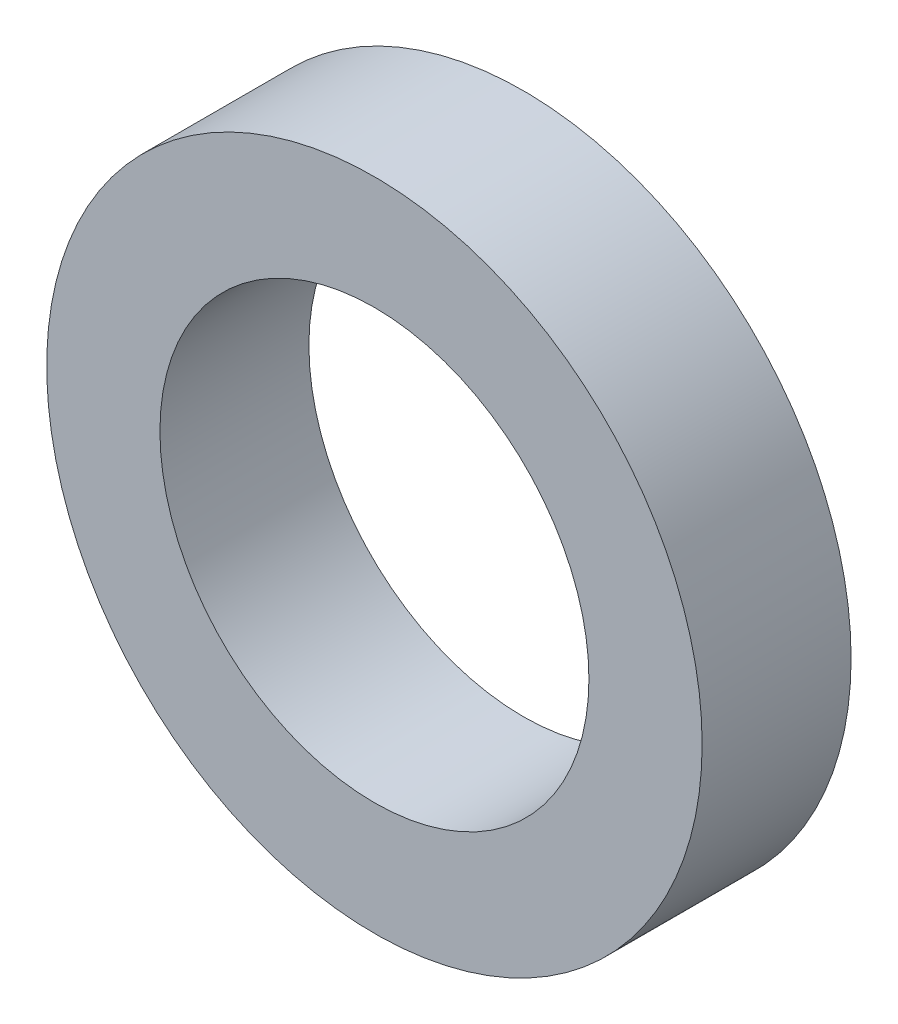
ISO-10303-21;
HEADER;
FILE_DESCRIPTION(('STEP AP214'),'2;1');
FILE_NAME('part.step','',(''),(''),'','','');
FILE_SCHEMA(('AUTOMOTIVE_DESIGN { 1 0 10303 214 1 1 1 1 }'));
ENDSEC;
DATA;
#1=APPLICATION_CONTEXT('core data for automotive mechanical design processes');
#2=APPLICATION_PROTOCOL_DEFINITION('international standard','automotive_design',2000,#1);
#3=PRODUCT_CONTEXT('',#1,'mechanical');
#4=PRODUCT('Part','Part','',(#3));
#5=PRODUCT_RELATED_PRODUCT_CATEGORY('part','',(#4));
#6=PRODUCT_DEFINITION_FORMATION('','',#4);
#7=PRODUCT_DEFINITION_CONTEXT('part definition',#1,'design');
#8=PRODUCT_DEFINITION('design','',#6,#7);
#9=PRODUCT_DEFINITION_SHAPE('','',#8);
#10=(LENGTH_UNIT() NAMED_UNIT(*) SI_UNIT(.MILLI.,.METRE.));
#11=(NAMED_UNIT(*) PLANE_ANGLE_UNIT() SI_UNIT($,.RADIAN.));
#12=(NAMED_UNIT(*) SI_UNIT($,.STERADIAN.) SOLID_ANGLE_UNIT());
#13=UNCERTAINTY_MEASURE_WITH_UNIT(LENGTH_MEASURE(1.E-05),#10,'distance_accuracy_value','');
#14=(GEOMETRIC_REPRESENTATION_CONTEXT(3) GLOBAL_UNCERTAINTY_ASSIGNED_CONTEXT((#13)) GLOBAL_UNIT_ASSIGNED_CONTEXT((#10,
#11,#12)) REPRESENTATION_CONTEXT('',''));
#15=CARTESIAN_POINT('',(0.,0.,0.));
#16=DIRECTION('',(0.,0.,1.));
#17=DIRECTION('',(1.,0.,0.));
#18=AXIS2_PLACEMENT_3D('',#15,#16,#17);
#19=CARTESIAN_POINT('',(0.,0.,2.5));
#20=DIRECTION('',(0.,0.,-1.));
#21=DIRECTION('',(-1.,0.,0.));
#22=AXIS2_PLACEMENT_3D('',#19,#20,#21);
#23=CYLINDRICAL_SURFACE('',#22,5.5);
#24=CARTESIAN_POINT('',(0.,0.,2.5));
#25=DIRECTION('',(0.,0.,1.));
#26=DIRECTION('',(1.,0.,0.));
#27=AXIS2_PLACEMENT_3D('',#24,#25,#26);
#28=CIRCLE('',#27,5.5);
#29=CARTESIAN_POINT('',(5.5,0.,2.5));
#30=VERTEX_POINT('',#29);
#31=EDGE_CURVE('E10',#30,#30,#28,.T.);
#32=ORIENTED_EDGE('',*,*,#31,.F.);
#33=EDGE_LOOP('',(#32));
#34=FACE_BOUND('',#33,.T.);
#35=CARTESIAN_POINT('',(0.,0.,0.));
#36=DIRECTION('',(0.,0.,1.));
#37=DIRECTION('',(1.,0.,0.));
#38=AXIS2_PLACEMENT_3D('',#35,#36,#37);
#39=CIRCLE('',#38,5.5);
#40=CARTESIAN_POINT('',(5.5,0.,0.));
#41=VERTEX_POINT('',#40);
#42=EDGE_CURVE('E48',#41,#41,#39,.T.);
#43=ORIENTED_EDGE('',*,*,#42,.T.);
#44=EDGE_LOOP('',(#43));
#45=FACE_BOUND('',#44,.T.);
#46=ADVANCED_FACE('F41',(#34,#45),#23,.T.);
#47=CARTESIAN_POINT('',(0.,0.,2.5));
#48=DIRECTION('',(0.,0.,1.));
#49=DIRECTION('',(1.,0.,0.));
#50=AXIS2_PLACEMENT_3D('',#47,#48,#49);
#51=PLANE('',#50);
#52=CARTESIAN_POINT('',(0.,0.,2.5));
#53=DIRECTION('',(0.,0.,1.));
#54=DIRECTION('',(1.,0.,0.));
#55=AXIS2_PLACEMENT_3D('',#52,#53,#54);
#56=CIRCLE('',#55,3.6);
#57=CARTESIAN_POINT('',(3.6,0.,2.5));
#58=VERTEX_POINT('',#57);
#59=EDGE_CURVE('E54',#58,#58,#56,.T.);
#60=ORIENTED_EDGE('',*,*,#59,.F.);
#61=EDGE_LOOP('',(#60));
#62=FACE_BOUND('',#61,.T.);
#63=ORIENTED_EDGE('',*,*,#31,.T.);
#64=EDGE_LOOP('',(#63));
#65=FACE_BOUND('',#64,.T.);
#66=ADVANCED_FACE('F66',(#62,#65),#51,.T.);
#67=CARTESIAN_POINT('',(0.,0.,0.));
#68=DIRECTION('',(0.,0.,1.));
#69=DIRECTION('',(1.,0.,0.));
#70=AXIS2_PLACEMENT_3D('',#67,#68,#69);
#71=PLANE('',#70);
#72=CARTESIAN_POINT('',(0.,0.,0.));
#73=DIRECTION('',(0.,0.,1.));
#74=DIRECTION('',(1.,0.,0.));
#75=AXIS2_PLACEMENT_3D('',#72,#73,#74);
#76=CIRCLE('',#75,3.6);
#77=CARTESIAN_POINT('',(3.6,0.,0.));
#78=VERTEX_POINT('',#77);
#79=EDGE_CURVE('E44',#78,#78,#76,.F.);
#80=ORIENTED_EDGE('',*,*,#79,.F.);
#81=EDGE_LOOP('',(#80));
#82=FACE_BOUND('',#81,.T.);
#83=ORIENTED_EDGE('',*,*,#42,.F.);
#84=EDGE_LOOP('',(#83));
#85=FACE_BOUND('',#84,.T.);
#86=ADVANCED_FACE('F63',(#82,#85),#71,.F.);
#87=CARTESIAN_POINT('',(0.,0.,2.5));
#88=DIRECTION('',(0.,0.,-1.));
#89=DIRECTION('',(-1.,0.,0.));
#90=AXIS2_PLACEMENT_3D('',#87,#88,#89);
#91=CYLINDRICAL_SURFACE('',#90,3.6);
#92=ORIENTED_EDGE('',*,*,#59,.T.);
#93=EDGE_LOOP('',(#92));
#94=FACE_BOUND('',#93,.T.);
#95=ORIENTED_EDGE('',*,*,#79,.T.);
#96=EDGE_LOOP('',(#95));
#97=FACE_BOUND('',#96,.T.);
#98=ADVANCED_FACE('F61',(#94,#97),#91,.F.);
#99=CLOSED_SHELL('',(#46,#66,#86,#98));
#100=MANIFOLD_SOLID_BREP('B2',#99);
#101=ADVANCED_BREP_SHAPE_REPRESENTATION('',(#18,#100),#14);
#102=SHAPE_DEFINITION_REPRESENTATION(#9,#101);
ENDSEC;
END-ISO-10303-21;
